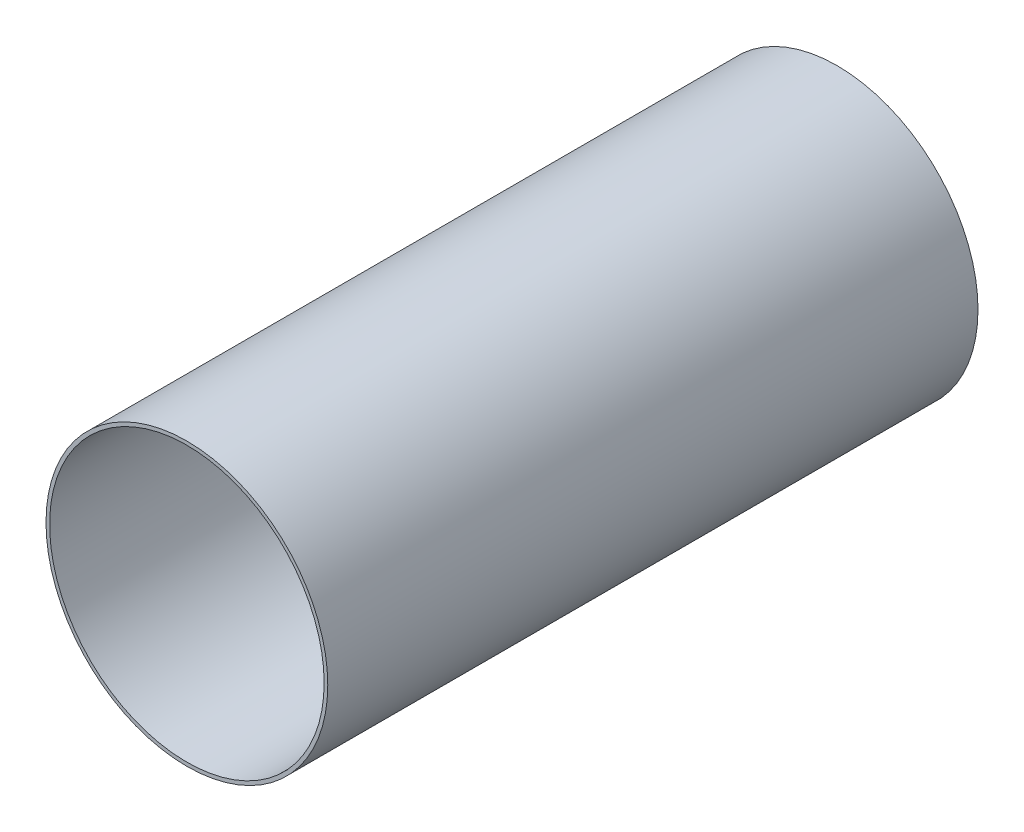
ISO-10303-21;
HEADER;
FILE_DESCRIPTION(('STEP AP214'),'2;1');
FILE_NAME('part.step','',(''),(''),'','','');
FILE_SCHEMA(('AUTOMOTIVE_DESIGN { 1 0 10303 214 1 1 1 1 }'));
ENDSEC;
DATA;
#1=APPLICATION_CONTEXT('core data for automotive mechanical design processes');
#2=APPLICATION_PROTOCOL_DEFINITION('international standard','automotive_design',2000,#1);
#3=PRODUCT_CONTEXT('',#1,'mechanical');
#4=PRODUCT('Part','Part','',(#3));
#5=PRODUCT_RELATED_PRODUCT_CATEGORY('part','',(#4));
#6=PRODUCT_DEFINITION_FORMATION('','',#4);
#7=PRODUCT_DEFINITION_CONTEXT('part definition',#1,'design');
#8=PRODUCT_DEFINITION('design','',#6,#7);
#9=PRODUCT_DEFINITION_SHAPE('','',#8);
#10=(LENGTH_UNIT() NAMED_UNIT(*) SI_UNIT(.MILLI.,.METRE.));
#11=(NAMED_UNIT(*) PLANE_ANGLE_UNIT() SI_UNIT($,.RADIAN.));
#12=(NAMED_UNIT(*) SI_UNIT($,.STERADIAN.) SOLID_ANGLE_UNIT());
#13=UNCERTAINTY_MEASURE_WITH_UNIT(LENGTH_MEASURE(1.E-05),#10,'distance_accuracy_value','');
#14=(GEOMETRIC_REPRESENTATION_CONTEXT(3) GLOBAL_UNCERTAINTY_ASSIGNED_CONTEXT((#13)) GLOBAL_UNIT_ASSIGNED_CONTEXT((#10,
#11,#12)) REPRESENTATION_CONTEXT('',''));
#15=CARTESIAN_POINT('',(0.,0.,0.));
#16=DIRECTION('',(0.,0.,1.));
#17=DIRECTION('',(1.,0.,0.));
#18=AXIS2_PLACEMENT_3D('',#15,#16,#17);
#19=CARTESIAN_POINT('',(0.,0.,228.6));
#20=DIRECTION('',(0.,0.,1.));
#21=DIRECTION('',(1.,0.,0.));
#22=AXIS2_PLACEMENT_3D('',#19,#20,#21);
#23=PLANE('',#22);
#24=CARTESIAN_POINT('',(0.,0.,228.6));
#25=DIRECTION('',(0.,0.,1.));
#26=DIRECTION('',(1.,0.,0.));
#27=AXIS2_PLACEMENT_3D('',#24,#25,#26);
#28=CIRCLE('',#27,49.53);
#29=CARTESIAN_POINT('',(49.53,0.,228.6));
#30=VERTEX_POINT('',#29);
#31=EDGE_CURVE('E10',#30,#30,#28,.T.);
#32=ORIENTED_EDGE('',*,*,#31,.T.);
#33=EDGE_LOOP('',(#32));
#34=FACE_BOUND('',#33,.T.);
#35=CARTESIAN_POINT('',(0.,0.,228.6));
#36=DIRECTION('',(0.,0.,1.));
#37=DIRECTION('',(1.,0.,0.));
#38=AXIS2_PLACEMENT_3D('',#35,#36,#37);
#39=CIRCLE('',#38,48.26);
#40=CARTESIAN_POINT('',(48.26,0.,228.6));
#41=VERTEX_POINT('',#40);
#42=EDGE_CURVE('E42',#41,#41,#39,.T.);
#43=ORIENTED_EDGE('',*,*,#42,.F.);
#44=EDGE_LOOP('',(#43));
#45=FACE_BOUND('',#44,.T.);
#46=ADVANCED_FACE('F31',(#34,#45),#23,.T.);
#47=CARTESIAN_POINT('',(0.,0.,0.));
#48=DIRECTION('',(0.,0.,1.));
#49=DIRECTION('',(1.,0.,0.));
#50=AXIS2_PLACEMENT_3D('',#47,#48,#49);
#51=PLANE('',#50);
#52=CARTESIAN_POINT('',(0.,0.,0.));
#53=DIRECTION('',(0.,0.,1.));
#54=DIRECTION('',(1.,0.,0.));
#55=AXIS2_PLACEMENT_3D('',#52,#53,#54);
#56=CIRCLE('',#55,49.53);
#57=CARTESIAN_POINT('',(49.53,0.,0.));
#58=VERTEX_POINT('',#57);
#59=EDGE_CURVE('E35',#58,#58,#56,.T.);
#60=ORIENTED_EDGE('',*,*,#59,.F.);
#61=EDGE_LOOP('',(#60));
#62=FACE_BOUND('',#61,.T.);
#63=CARTESIAN_POINT('',(0.,0.,0.));
#64=DIRECTION('',(0.,0.,1.));
#65=DIRECTION('',(1.,0.,0.));
#66=AXIS2_PLACEMENT_3D('',#63,#64,#65);
#67=CIRCLE('',#66,48.26);
#68=CARTESIAN_POINT('',(48.26,0.,0.));
#69=VERTEX_POINT('',#68);
#70=EDGE_CURVE('E44',#69,#69,#67,.T.);
#71=ORIENTED_EDGE('',*,*,#70,.T.);
#72=EDGE_LOOP('',(#71));
#73=FACE_BOUND('',#72,.T.);
#74=ADVANCED_FACE('F54',(#62,#73),#51,.F.);
#75=CARTESIAN_POINT('',(0.,0.,228.6));
#76=DIRECTION('',(0.,0.,-1.));
#77=DIRECTION('',(-1.,0.,0.));
#78=AXIS2_PLACEMENT_3D('',#75,#76,#77);
#79=CYLINDRICAL_SURFACE('',#78,49.53);
#80=ORIENTED_EDGE('',*,*,#31,.F.);
#81=EDGE_LOOP('',(#80));
#82=FACE_BOUND('',#81,.T.);
#83=ORIENTED_EDGE('',*,*,#59,.T.);
#84=EDGE_LOOP('',(#83));
#85=FACE_BOUND('',#84,.T.);
#86=ADVANCED_FACE('F33',(#82,#85),#79,.T.);
#87=CARTESIAN_POINT('',(0.,0.,228.6));
#88=DIRECTION('',(0.,0.,-1.));
#89=DIRECTION('',(-1.,0.,0.));
#90=AXIS2_PLACEMENT_3D('',#87,#88,#89);
#91=CYLINDRICAL_SURFACE('',#90,48.26);
#92=ORIENTED_EDGE('',*,*,#42,.T.);
#93=EDGE_LOOP('',(#92));
#94=FACE_BOUND('',#93,.T.);
#95=ORIENTED_EDGE('',*,*,#70,.F.);
#96=EDGE_LOOP('',(#95));
#97=FACE_BOUND('',#96,.T.);
#98=ADVANCED_FACE('F50',(#94,#97),#91,.F.);
#99=CLOSED_SHELL('',(#46,#74,#86,#98));
#100=MANIFOLD_SOLID_BREP('B2',#99);
#101=ADVANCED_BREP_SHAPE_REPRESENTATION('',(#18,#100),#14);
#102=SHAPE_DEFINITION_REPRESENTATION(#9,#101);
ENDSEC;
END-ISO-10303-21;
